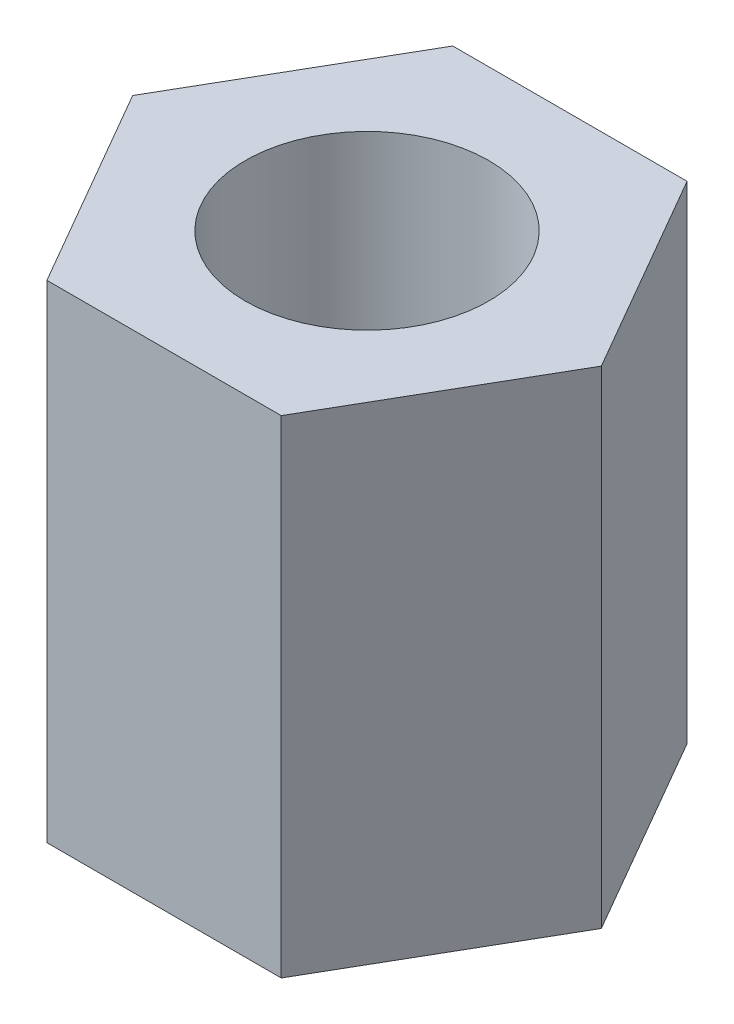
ISO-10303-21;
HEADER;
FILE_DESCRIPTION(('STEP AP214'),'2;1');
FILE_NAME('part.step','',(''),(''),'','','');
FILE_SCHEMA(('AUTOMOTIVE_DESIGN { 1 0 10303 214 1 1 1 1 }'));
ENDSEC;
DATA;
#1=APPLICATION_CONTEXT('core data for automotive mechanical design processes');
#2=APPLICATION_PROTOCOL_DEFINITION('international standard','automotive_design',2000,#1);
#3=PRODUCT_CONTEXT('',#1,'mechanical');
#4=PRODUCT('Part','Part','',(#3));
#5=PRODUCT_RELATED_PRODUCT_CATEGORY('part','',(#4));
#6=PRODUCT_DEFINITION_FORMATION('','',#4);
#7=PRODUCT_DEFINITION_CONTEXT('part definition',#1,'design');
#8=PRODUCT_DEFINITION('design','',#6,#7);
#9=PRODUCT_DEFINITION_SHAPE('','',#8);
#10=(LENGTH_UNIT() NAMED_UNIT(*) SI_UNIT(.MILLI.,.METRE.));
#11=(NAMED_UNIT(*) PLANE_ANGLE_UNIT() SI_UNIT($,.RADIAN.));
#12=(NAMED_UNIT(*) SI_UNIT($,.STERADIAN.) SOLID_ANGLE_UNIT());
#13=UNCERTAINTY_MEASURE_WITH_UNIT(LENGTH_MEASURE(1.E-05),#10,'distance_accuracy_value','');
#14=(GEOMETRIC_REPRESENTATION_CONTEXT(3) GLOBAL_UNCERTAINTY_ASSIGNED_CONTEXT((#13)) GLOBAL_UNIT_ASSIGNED_CONTEXT((#10,
#11,#12)) REPRESENTATION_CONTEXT('',''));
#15=CARTESIAN_POINT('',(0.,0.,0.));
#16=DIRECTION('',(0.,0.,1.));
#17=DIRECTION('',(1.,0.,0.));
#18=AXIS2_PLACEMENT_3D('',#15,#16,#17);
#19=CARTESIAN_POINT('',(0.,6.,0.));
#20=DIRECTION('',(0.,1.,0.));
#21=DIRECTION('',(0.,0.,1.));
#22=AXIS2_PLACEMENT_3D('',#19,#20,#21);
#23=PLANE('',#22);
#24=DIRECTION('',(1.,0.,0.));
#25=VECTOR('',#24,1.);
#26=CARTESIAN_POINT('',(-1.44337567297406,6.,2.5));
#27=LINE('',#26,#25);
#28=CARTESIAN_POINT('',(-1.44337567297406,6.,2.5));
#29=VERTEX_POINT('',#28);
#30=CARTESIAN_POINT('',(1.44337567297406,6.,2.5));
#31=VERTEX_POINT('',#30);
#32=EDGE_CURVE('E134',#29,#31,#27,.T.);
#33=ORIENTED_EDGE('',*,*,#32,.T.);
#34=DIRECTION('',(0.5,0.,-0.866025403784439));
#35=VECTOR('',#34,1.);
#36=CARTESIAN_POINT('',(1.44337567297406,6.,2.5));
#37=LINE('',#36,#35);
#38=CARTESIAN_POINT('',(2.88675134594813,6.,0.));
#39=VERTEX_POINT('',#38);
#40=EDGE_CURVE('E93',#31,#39,#37,.T.);
#41=ORIENTED_EDGE('',*,*,#40,.T.);
#42=DIRECTION('',(-0.5,0.,-0.866025403784439));
#43=VECTOR('',#42,1.);
#44=CARTESIAN_POINT('',(2.88675134594813,6.,0.));
#45=LINE('',#44,#43);
#46=CARTESIAN_POINT('',(1.44337567297406,6.,-2.5));
#47=VERTEX_POINT('',#46);
#48=EDGE_CURVE('E107',#39,#47,#45,.T.);
#49=ORIENTED_EDGE('',*,*,#48,.T.);
#50=DIRECTION('',(-1.,0.,0.));
#51=VECTOR('',#50,1.);
#52=CARTESIAN_POINT('',(1.44337567297406,6.,-2.5));
#53=LINE('',#52,#51);
#54=CARTESIAN_POINT('',(-1.44337567297407,6.,-2.5));
#55=VERTEX_POINT('',#54);
#56=EDGE_CURVE('E99',#47,#55,#53,.T.);
#57=ORIENTED_EDGE('',*,*,#56,.T.);
#58=DIRECTION('',(-0.5,0.,0.866025403784439));
#59=VECTOR('',#58,1.);
#60=CARTESIAN_POINT('',(-1.44337567297407,6.,-2.5));
#61=LINE('',#60,#59);
#62=CARTESIAN_POINT('',(-2.88675134594813,6.,0.));
#63=VERTEX_POINT('',#62);
#64=EDGE_CURVE('E101',#55,#63,#61,.T.);
#65=ORIENTED_EDGE('',*,*,#64,.T.);
#66=DIRECTION('',(0.5,0.,0.866025403784438));
#67=VECTOR('',#66,1.);
#68=CARTESIAN_POINT('',(-2.88675134594813,6.,0.));
#69=LINE('',#68,#67);
#70=EDGE_CURVE('E57',#63,#29,#69,.T.);
#71=ORIENTED_EDGE('',*,*,#70,.T.);
#72=EDGE_LOOP('',(#33,#41,#49,#57,#65,#71));
#73=FACE_BOUND('',#72,.T.);
#74=CARTESIAN_POINT('',(0.,6.,0.));
#75=DIRECTION('',(0.,1.,0.));
#76=DIRECTION('',(0.,0.,1.));
#77=AXIS2_PLACEMENT_3D('',#74,#75,#76);
#78=CIRCLE('',#77,1.5);
#79=CARTESIAN_POINT('',(0.,6.,1.5));
#80=VERTEX_POINT('',#79);
#81=EDGE_CURVE('E126',#80,#80,#78,.T.);
#82=ORIENTED_EDGE('',*,*,#81,.F.);
#83=EDGE_LOOP('',(#82));
#84=FACE_BOUND('',#83,.T.);
#85=ADVANCED_FACE('F39',(#73,#84),#23,.T.);
#86=CARTESIAN_POINT('',(0.,0.,0.));
#87=DIRECTION('',(0.,1.,0.));
#88=DIRECTION('',(0.,0.,1.));
#89=AXIS2_PLACEMENT_3D('',#86,#87,#88);
#90=PLANE('',#89);
#91=DIRECTION('',(1.,0.,0.));
#92=VECTOR('',#91,1.);
#93=CARTESIAN_POINT('',(-1.44337567297406,0.,2.5));
#94=LINE('',#93,#92);
#95=CARTESIAN_POINT('',(-1.44337567297406,0.,2.5));
#96=VERTEX_POINT('',#95);
#97=CARTESIAN_POINT('',(1.44337567297406,0.,2.5));
#98=VERTEX_POINT('',#97);
#99=EDGE_CURVE('E125',#96,#98,#94,.T.);
#100=ORIENTED_EDGE('',*,*,#99,.F.);
#101=DIRECTION('',(0.5,0.,0.866025403784438));
#102=VECTOR('',#101,1.);
#103=CARTESIAN_POINT('',(-2.88675134594813,0.,0.));
#104=LINE('',#103,#102);
#105=CARTESIAN_POINT('',(-2.88675134594813,0.,0.));
#106=VERTEX_POINT('',#105);
#107=EDGE_CURVE('E82',#106,#96,#104,.T.);
#108=ORIENTED_EDGE('',*,*,#107,.F.);
#109=DIRECTION('',(-0.5,0.,0.866025403784439));
#110=VECTOR('',#109,1.);
#111=CARTESIAN_POINT('',(-1.44337567297407,0.,-2.5));
#112=LINE('',#111,#110);
#113=CARTESIAN_POINT('',(-1.44337567297407,0.,-2.5));
#114=VERTEX_POINT('',#113);
#115=EDGE_CURVE('E80',#114,#106,#112,.T.);
#116=ORIENTED_EDGE('',*,*,#115,.F.);
#117=DIRECTION('',(-1.,0.,0.));
#118=VECTOR('',#117,1.);
#119=CARTESIAN_POINT('',(1.44337567297406,0.,-2.5));
#120=LINE('',#119,#118);
#121=CARTESIAN_POINT('',(1.44337567297406,0.,-2.5));
#122=VERTEX_POINT('',#121);
#123=EDGE_CURVE('E114',#122,#114,#120,.T.);
#124=ORIENTED_EDGE('',*,*,#123,.F.);
#125=DIRECTION('',(-0.5,0.,-0.866025403784439));
#126=VECTOR('',#125,1.);
#127=CARTESIAN_POINT('',(2.88675134594813,0.,0.));
#128=LINE('',#127,#126);
#129=CARTESIAN_POINT('',(2.88675134594813,0.,0.));
#130=VERTEX_POINT('',#129);
#131=EDGE_CURVE('E127',#130,#122,#128,.T.);
#132=ORIENTED_EDGE('',*,*,#131,.F.);
#133=DIRECTION('',(0.5,0.,-0.866025403784439));
#134=VECTOR('',#133,1.);
#135=CARTESIAN_POINT('',(1.44337567297406,0.,2.5));
#136=LINE('',#135,#134);
#137=EDGE_CURVE('E130',#98,#130,#136,.T.);
#138=ORIENTED_EDGE('',*,*,#137,.F.);
#139=EDGE_LOOP('',(#100,#108,#116,#124,#132,#138));
#140=FACE_BOUND('',#139,.T.);
#141=CARTESIAN_POINT('',(0.,0.,0.));
#142=DIRECTION('',(0.,1.,0.));
#143=DIRECTION('',(0.,0.,1.));
#144=AXIS2_PLACEMENT_3D('',#141,#142,#143);
#145=CIRCLE('',#144,1.5);
#146=CARTESIAN_POINT('',(0.,0.,1.5));
#147=VERTEX_POINT('',#146);
#148=EDGE_CURVE('E228',#147,#147,#145,.T.);
#149=ORIENTED_EDGE('',*,*,#148,.T.);
#150=EDGE_LOOP('',(#149));
#151=FACE_BOUND('',#150,.T.);
#152=ADVANCED_FACE('F143',(#140,#151),#90,.F.);
#153=CARTESIAN_POINT('',(-1.44337567297406,6.,2.5));
#154=DIRECTION('',(0.,0.,-1.));
#155=DIRECTION('',(-1.,0.,0.));
#156=AXIS2_PLACEMENT_3D('',#153,#154,#155);
#157=PLANE('',#156);
#158=ORIENTED_EDGE('',*,*,#99,.T.);
#159=DIRECTION('',(0.,-1.,0.));
#160=VECTOR('',#159,1.);
#161=CARTESIAN_POINT('',(1.44337567297406,6.,2.5));
#162=LINE('',#161,#160);
#163=EDGE_CURVE('E11',#31,#98,#162,.T.);
#164=ORIENTED_EDGE('',*,*,#163,.F.);
#165=ORIENTED_EDGE('',*,*,#32,.F.);
#166=DIRECTION('',(0.,-1.,0.));
#167=VECTOR('',#166,1.);
#168=CARTESIAN_POINT('',(-1.44337567297406,6.,2.5));
#169=LINE('',#168,#167);
#170=EDGE_CURVE('E118',#29,#96,#169,.T.);
#171=ORIENTED_EDGE('',*,*,#170,.T.);
#172=EDGE_LOOP('',(#158,#164,#165,#171));
#173=FACE_BOUND('',#172,.T.);
#174=ADVANCED_FACE('F41',(#173),#157,.F.);
#175=CARTESIAN_POINT('',(1.44337567297406,6.,2.5));
#176=DIRECTION('',(-0.866025403784438,0.,-0.5));
#177=DIRECTION('',(-0.5,0.,0.866025403784439));
#178=AXIS2_PLACEMENT_3D('',#175,#176,#177);
#179=PLANE('',#178);
#180=ORIENTED_EDGE('',*,*,#137,.T.);
#181=DIRECTION('',(0.,-1.,0.));
#182=VECTOR('',#181,1.);
#183=CARTESIAN_POINT('',(2.88675134594813,6.,0.));
#184=LINE('',#183,#182);
#185=EDGE_CURVE('E48',#39,#130,#184,.T.);
#186=ORIENTED_EDGE('',*,*,#185,.F.);
#187=ORIENTED_EDGE('',*,*,#40,.F.);
#188=ORIENTED_EDGE('',*,*,#163,.T.);
#189=EDGE_LOOP('',(#180,#186,#187,#188));
#190=FACE_BOUND('',#189,.T.);
#191=ADVANCED_FACE('F170',(#190),#179,.F.);
#192=CARTESIAN_POINT('',(2.88675134594813,6.,0.));
#193=DIRECTION('',(-0.866025403784439,0.,0.5));
#194=DIRECTION('',(0.5,0.,0.866025403784439));
#195=AXIS2_PLACEMENT_3D('',#192,#193,#194);
#196=PLANE('',#195);
#197=ORIENTED_EDGE('',*,*,#131,.T.);
#198=DIRECTION('',(0.,-1.,0.));
#199=VECTOR('',#198,1.);
#200=CARTESIAN_POINT('',(1.44337567297406,6.,-2.5));
#201=LINE('',#200,#199);
#202=EDGE_CURVE('E113',#47,#122,#201,.T.);
#203=ORIENTED_EDGE('',*,*,#202,.F.);
#204=ORIENTED_EDGE('',*,*,#48,.F.);
#205=ORIENTED_EDGE('',*,*,#185,.T.);
#206=EDGE_LOOP('',(#197,#203,#204,#205));
#207=FACE_BOUND('',#206,.T.);
#208=ADVANCED_FACE('F141',(#207),#196,.F.);
#209=CARTESIAN_POINT('',(1.44337567297406,6.,-2.5));
#210=DIRECTION('',(0.,0.,1.));
#211=DIRECTION('',(1.,0.,0.));
#212=AXIS2_PLACEMENT_3D('',#209,#210,#211);
#213=PLANE('',#212);
#214=ORIENTED_EDGE('',*,*,#123,.T.);
#215=DIRECTION('',(0.,-1.,0.));
#216=VECTOR('',#215,1.);
#217=CARTESIAN_POINT('',(-1.44337567297407,6.,-2.5));
#218=LINE('',#217,#216);
#219=EDGE_CURVE('E112',#55,#114,#218,.T.);
#220=ORIENTED_EDGE('',*,*,#219,.F.);
#221=ORIENTED_EDGE('',*,*,#56,.F.);
#222=ORIENTED_EDGE('',*,*,#202,.T.);
#223=EDGE_LOOP('',(#214,#220,#221,#222));
#224=FACE_BOUND('',#223,.T.);
#225=ADVANCED_FACE('F115',(#224),#213,.F.);
#226=CARTESIAN_POINT('',(-1.44337567297407,6.,-2.5));
#227=DIRECTION('',(0.866025403784439,0.,0.5));
#228=DIRECTION('',(0.5,0.,-0.866025403784439));
#229=AXIS2_PLACEMENT_3D('',#226,#227,#228);
#230=PLANE('',#229);
#231=ORIENTED_EDGE('',*,*,#115,.T.);
#232=DIRECTION('',(0.,-1.,0.));
#233=VECTOR('',#232,1.);
#234=CARTESIAN_POINT('',(-2.88675134594813,6.,0.));
#235=LINE('',#234,#233);
#236=EDGE_CURVE('E117',#63,#106,#235,.T.);
#237=ORIENTED_EDGE('',*,*,#236,.F.);
#238=ORIENTED_EDGE('',*,*,#64,.F.);
#239=ORIENTED_EDGE('',*,*,#219,.T.);
#240=EDGE_LOOP('',(#231,#237,#238,#239));
#241=FACE_BOUND('',#240,.T.);
#242=ADVANCED_FACE('F120',(#241),#230,.F.);
#243=CARTESIAN_POINT('',(-2.88675134594813,6.,0.));
#244=DIRECTION('',(0.866025403784439,0.,-0.5));
#245=DIRECTION('',(-0.5,0.,-0.866025403784439));
#246=AXIS2_PLACEMENT_3D('',#243,#244,#245);
#247=PLANE('',#246);
#248=ORIENTED_EDGE('',*,*,#107,.T.);
#249=ORIENTED_EDGE('',*,*,#170,.F.);
#250=ORIENTED_EDGE('',*,*,#70,.F.);
#251=ORIENTED_EDGE('',*,*,#236,.T.);
#252=EDGE_LOOP('',(#248,#249,#250,#251));
#253=FACE_BOUND('',#252,.T.);
#254=ADVANCED_FACE('F146',(#253),#247,.F.);
#255=CARTESIAN_POINT('',(0.,6.,0.));
#256=DIRECTION('',(0.,-1.,0.));
#257=DIRECTION('',(0.,0.,-1.));
#258=AXIS2_PLACEMENT_3D('',#255,#256,#257);
#259=CYLINDRICAL_SURFACE('',#258,1.5);
#260=ORIENTED_EDGE('',*,*,#81,.T.);
#261=EDGE_LOOP('',(#260));
#262=FACE_BOUND('',#261,.T.);
#263=ORIENTED_EDGE('',*,*,#148,.F.);
#264=EDGE_LOOP('',(#263));
#265=FACE_BOUND('',#264,.T.);
#266=ADVANCED_FACE('F152',(#262,#265),#259,.F.);
#267=CLOSED_SHELL('',(#85,#152,#174,#191,#208,#225,#242,#254,#266));
#268=MANIFOLD_SOLID_BREP('B2',#267);
#269=ADVANCED_BREP_SHAPE_REPRESENTATION('',(#18,#268),#14);
#270=SHAPE_DEFINITION_REPRESENTATION(#9,#269);
ENDSEC;
END-ISO-10303-21;
